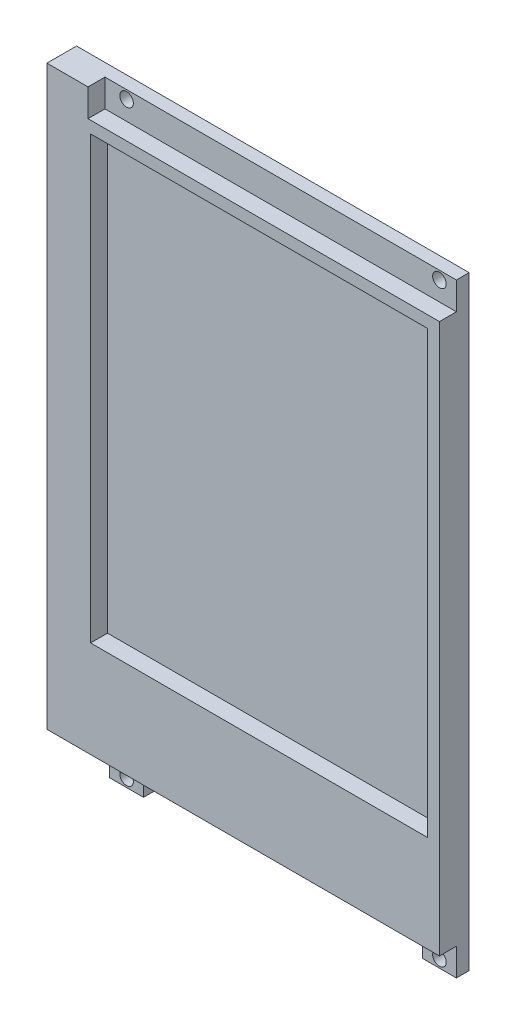
ISO-10303-21;
HEADER;
FILE_DESCRIPTION(('STEP AP214'),'2;1');
FILE_NAME('part.step','',(''),(''),'','','');
FILE_SCHEMA(('AUTOMOTIVE_DESIGN { 1 0 10303 214 1 1 1 1 }'));
ENDSEC;
DATA;
#1=APPLICATION_CONTEXT('core data for automotive mechanical design processes');
#2=APPLICATION_PROTOCOL_DEFINITION('international standard','automotive_design',2000,#1);
#3=PRODUCT_CONTEXT('',#1,'mechanical');
#4=PRODUCT('Part','Part','',(#3));
#5=PRODUCT_RELATED_PRODUCT_CATEGORY('part','',(#4));
#6=PRODUCT_DEFINITION_FORMATION('','',#4);
#7=PRODUCT_DEFINITION_CONTEXT('part definition',#1,'design');
#8=PRODUCT_DEFINITION('design','',#6,#7);
#9=PRODUCT_DEFINITION_SHAPE('','',#8);
#10=(LENGTH_UNIT() NAMED_UNIT(*) SI_UNIT(.MILLI.,.METRE.));
#11=(NAMED_UNIT(*) PLANE_ANGLE_UNIT() SI_UNIT($,.RADIAN.));
#12=(NAMED_UNIT(*) SI_UNIT($,.STERADIAN.) SOLID_ANGLE_UNIT());
#13=UNCERTAINTY_MEASURE_WITH_UNIT(LENGTH_MEASURE(1.E-05),#10,'distance_accuracy_value','');
#14=(GEOMETRIC_REPRESENTATION_CONTEXT(3) GLOBAL_UNCERTAINTY_ASSIGNED_CONTEXT((#13)) GLOBAL_UNIT_ASSIGNED_CONTEXT((#10,
#11,#12)) REPRESENTATION_CONTEXT('',''));
#15=CARTESIAN_POINT('',(0.,0.,0.));
#16=DIRECTION('',(0.,0.,1.));
#17=DIRECTION('',(1.,0.,0.));
#18=AXIS2_PLACEMENT_3D('',#15,#16,#17);
#19=CARTESIAN_POINT('',(-44.9999999999998,-96.6000000000001,7.00000000000038));
#20=DIRECTION('',(0.,1.,0.));
#21=DIRECTION('',(0.,0.,1.));
#22=AXIS2_PLACEMENT_3D('',#19,#20,#21);
#23=PLANE('',#22);
#24=DIRECTION('',(1.,0.,0.));
#25=VECTOR('',#24,1.);
#26=CARTESIAN_POINT('',(-44.9999999999998,-96.6000000000001,4.26741975090295E-13));
#27=LINE('',#26,#25);
#28=CARTESIAN_POINT('',(-34.1999999999983,-96.6000000000001,3.00107161343988E-13));
#29=VERTEX_POINT('',#28);
#30=CARTESIAN_POINT('',(-26.1999999999983,-96.6000000000001,3.86843335142828E-13));
#31=VERTEX_POINT('',#30);
#32=EDGE_CURVE('E294',#29,#31,#27,.T.);
#33=ORIENTED_EDGE('',*,*,#32,.T.);
#34=DIRECTION('',(0.,0.,1.));
#35=VECTOR('',#34,1.);
#36=CARTESIAN_POINT('',(-26.1999999999983,-96.6000000000002,7.00000000000046));
#37=LINE('',#36,#35);
#38=CARTESIAN_POINT('',(-26.1999999999983,-96.6000000000001,3.00000000000036));
#39=VERTEX_POINT('',#38);
#40=EDGE_CURVE('E183',#31,#39,#37,.T.);
#41=ORIENTED_EDGE('',*,*,#40,.T.);
#42=DIRECTION('',(-1.,0.,0.));
#43=VECTOR('',#42,1.);
#44=CARTESIAN_POINT('',(-44.9999999999998,-96.6000000000002,3.00000000000038));
#45=LINE('',#44,#43);
#46=CARTESIAN_POINT('',(-34.1999999999983,-96.6000000000002,3.00000000000034));
#47=VERTEX_POINT('',#46);
#48=EDGE_CURVE('E206',#39,#47,#45,.T.);
#49=ORIENTED_EDGE('',*,*,#48,.T.);
#50=DIRECTION('',(0.,0.,-1.));
#51=VECTOR('',#50,1.);
#52=CARTESIAN_POINT('',(-34.1999999999983,-96.6000000000001,7.00000000000012));
#53=LINE('',#52,#51);
#54=EDGE_CURVE('E193',#47,#29,#53,.T.);
#55=ORIENTED_EDGE('',*,*,#54,.T.);
#56=EDGE_LOOP('',(#33,#41,#49,#55));
#57=FACE_BOUND('',#56,.T.);
#58=ADVANCED_FACE('F32',(#57),#23,.F.);
#59=CARTESIAN_POINT('',(-59.9999999999998,-90.1000000000015,3.00000000000034));
#60=DIRECTION('',(0.,0.,-1.));
#61=DIRECTION('',(-1.,0.,0.));
#62=AXIS2_PLACEMENT_3D('',#59,#60,#61);
#63=PLANE('',#62);
#64=CARTESIAN_POINT('',(-30.1999999999983,-94.6000000000001,3.00000000000031));
#65=DIRECTION('',(0.,0.,-1.));
#66=DIRECTION('',(-1.,0.,0.));
#67=AXIS2_PLACEMENT_3D('',#64,#65,#66);
#68=CIRCLE('',#67,1.6);
#69=CARTESIAN_POINT('',(-31.7999999999983,-94.6000000000001,3.00000000000031));
#70=VERTEX_POINT('',#69);
#71=EDGE_CURVE('E318',#70,#70,#68,.F.);
#72=ORIENTED_EDGE('',*,*,#71,.F.);
#73=EDGE_LOOP('',(#72));
#74=FACE_BOUND('',#73,.T.);
#75=ORIENTED_EDGE('',*,*,#48,.F.);
#76=DIRECTION('',(0.,1.,0.));
#77=VECTOR('',#76,1.);
#78=CARTESIAN_POINT('',(-26.1999999999983,-90.1000000000013,3.00000000000038));
#79=LINE('',#78,#77);
#80=CARTESIAN_POINT('',(-26.1999999999983,-90.1,3.00000000000036));
#81=VERTEX_POINT('',#80);
#82=EDGE_CURVE('E11',#39,#81,#79,.T.);
#83=ORIENTED_EDGE('',*,*,#82,.T.);
#84=DIRECTION('',(-1.,0.,0.));
#85=VECTOR('',#84,1.);
#86=CARTESIAN_POINT('',(-59.9999999999998,-90.1000000000015,3.00000000000034));
#87=LINE('',#86,#85);
#88=CARTESIAN_POINT('',(-34.1999999999983,-90.1000000000014,3.00000000000034));
#89=VERTEX_POINT('',#88);
#90=EDGE_CURVE('E54',#81,#89,#87,.T.);
#91=ORIENTED_EDGE('',*,*,#90,.T.);
#92=DIRECTION('',(0.,-1.,0.));
#93=VECTOR('',#92,1.);
#94=CARTESIAN_POINT('',(-34.1999999999983,-90.1000000000014,3.00000000000036));
#95=LINE('',#94,#93);
#96=EDGE_CURVE('E321',#89,#47,#95,.T.);
#97=ORIENTED_EDGE('',*,*,#96,.T.);
#98=EDGE_LOOP('',(#75,#83,#91,#97));
#99=FACE_BOUND('',#98,.T.);
#100=ADVANCED_FACE('F365',(#74,#99),#63,.F.);
#101=CARTESIAN_POINT('',(47.6000000000001,46.0000000000002,6.99999999999976));
#102=DIRECTION('',(0.,-1.,0.));
#103=DIRECTION('',(1.,0.,0.));
#104=AXIS2_PLACEMENT_3D('',#101,#102,#103);
#105=PLANE('',#104);
#106=DIRECTION('',(-1.,0.,0.));
#107=VECTOR('',#106,1.);
#108=CARTESIAN_POINT('',(47.6000000000001,46.0000000000002,6.99999999999976));
#109=LINE('',#108,#107);
#110=CARTESIAN_POINT('',(-35.2999999999994,46.0000000000001,6.9999999999998));
#111=VERTEX_POINT('',#110);
#112=CARTESIAN_POINT('',(-44.9999999999996,46.,6.99999999999979));
#113=VERTEX_POINT('',#112);
#114=EDGE_CURVE('E300',#111,#113,#109,.T.);
#115=ORIENTED_EDGE('',*,*,#114,.F.);
#116=DIRECTION('',(0.,0.,-1.));
#117=VECTOR('',#116,1.);
#118=CARTESIAN_POINT('',(-35.2999999999994,46.0000000000001,6.9999999999998));
#119=LINE('',#118,#117);
#120=CARTESIAN_POINT('',(-35.2999999999994,46.,2.99999999999998));
#121=VERTEX_POINT('',#120);
#122=EDGE_CURVE('E238',#111,#121,#119,.T.);
#123=ORIENTED_EDGE('',*,*,#122,.T.);
#124=DIRECTION('',(1.,0.,0.));
#125=VECTOR('',#124,1.);
#126=CARTESIAN_POINT('',(47.6000000000001,46.0000000000004,2.99999999999978));
#127=LINE('',#126,#125);
#128=CARTESIAN_POINT('',(47.6000000000001,46.0000000000004,2.99999999999978));
#129=VERTEX_POINT('',#128);
#130=EDGE_CURVE('E235',#121,#129,#127,.T.);
#131=ORIENTED_EDGE('',*,*,#130,.T.);
#132=DIRECTION('',(0.,0.,-1.));
#133=VECTOR('',#132,1.);
#134=CARTESIAN_POINT('',(47.6000000000001,46.0000000000002,6.99999999999976));
#135=LINE('',#134,#133);
#136=CARTESIAN_POINT('',(47.6000000000001,46.0000000000003,-2.84494650060196E-13));
#137=VERTEX_POINT('',#136);
#138=EDGE_CURVE('E307',#129,#137,#135,.T.);
#139=ORIENTED_EDGE('',*,*,#138,.T.);
#140=DIRECTION('',(-1.,0.,0.));
#141=VECTOR('',#140,1.);
#142=CARTESIAN_POINT('',(47.6000000000001,46.0000000000003,-2.84494650060196E-13));
#143=LINE('',#142,#141);
#144=CARTESIAN_POINT('',(-44.9999999999996,46.,0.));
#145=VERTEX_POINT('',#144);
#146=EDGE_CURVE('E288',#137,#145,#143,.T.);
#147=ORIENTED_EDGE('',*,*,#146,.T.);
#148=DIRECTION('',(0.,0.,-1.));
#149=VECTOR('',#148,1.);
#150=CARTESIAN_POINT('',(-44.9999999999996,46.,6.99999999999979));
#151=LINE('',#150,#149);
#152=EDGE_CURVE('E312',#113,#145,#151,.T.);
#153=ORIENTED_EDGE('',*,*,#152,.F.);
#154=EDGE_LOOP('',(#115,#123,#131,#139,#147,#153));
#155=FACE_BOUND('',#154,.T.);
#156=ADVANCED_FACE('F34',(#155),#105,.F.);
#157=CARTESIAN_POINT('',(-44.9999999999996,46.,6.99999999999979));
#158=DIRECTION('',(1.,0.,0.));
#159=DIRECTION('',(0.,1.,0.));
#160=AXIS2_PLACEMENT_3D('',#157,#158,#159);
#161=PLANE('',#160);
#162=DIRECTION('',(0.,-1.,0.));
#163=VECTOR('',#162,1.);
#164=CARTESIAN_POINT('',(-44.9999999999996,46.,0.));
#165=LINE('',#164,#163);
#166=CARTESIAN_POINT('',(-44.9999999999998,-90.1,2.89698820488127E-13));
#167=VERTEX_POINT('',#166);
#168=EDGE_CURVE('E291',#145,#167,#165,.T.);
#169=ORIENTED_EDGE('',*,*,#168,.T.);
#170=DIRECTION('',(0.,0.,1.));
#171=VECTOR('',#170,1.);
#172=CARTESIAN_POINT('',(-44.9999999999997,-90.1000000000013,7.00000000000004));
#173=LINE('',#172,#171);
#174=CARTESIAN_POINT('',(-44.9999999999998,-90.1000000000013,7.00000000000004));
#175=VERTEX_POINT('',#174);
#176=EDGE_CURVE('E213',#167,#175,#173,.T.);
#177=ORIENTED_EDGE('',*,*,#176,.T.);
#178=DIRECTION('',(0.,-1.,0.));
#179=VECTOR('',#178,1.);
#180=CARTESIAN_POINT('',(-44.9999999999996,46.,6.99999999999979));
#181=LINE('',#180,#179);
#182=EDGE_CURVE('E302',#113,#175,#181,.T.);
#183=ORIENTED_EDGE('',*,*,#182,.F.);
#184=ORIENTED_EDGE('',*,*,#152,.T.);
#185=EDGE_LOOP('',(#169,#177,#183,#184));
#186=FACE_BOUND('',#185,.T.);
#187=ADVANCED_FACE('F351',(#186),#161,.F.);
#188=CARTESIAN_POINT('',(47.6000000000004,-96.6000000000003,3.00000000000013));
#189=VERTEX_POINT('',#188);
#190=CARTESIAN_POINT('',(39.6000000000018,-96.6000000000002,3.00000000000016));
#191=VERTEX_POINT('',#190);
#192=EDGE_CURVE('E207',#189,#191,#45,.T.);
#193=ORIENTED_EDGE('',*,*,#192,.T.);
#194=DIRECTION('',(0.,0.,-1.));
#195=VECTOR('',#194,1.);
#196=CARTESIAN_POINT('',(39.6000000000018,-96.6000000000001,7.00000000000006));
#197=LINE('',#196,#195);
#198=CARTESIAN_POINT('',(39.6000000000018,-96.6000000000002,1.96023752785379E-13));
#199=VERTEX_POINT('',#198);
#200=EDGE_CURVE('E47',#191,#199,#197,.T.);
#201=ORIENTED_EDGE('',*,*,#200,.T.);
#202=CARTESIAN_POINT('',(47.6000000000004,-96.6000000000001,1.6826817716975E-13));
#203=VERTEX_POINT('',#202);
#204=EDGE_CURVE('E177',#199,#203,#27,.T.);
#205=ORIENTED_EDGE('',*,*,#204,.T.);
#206=DIRECTION('',(0.,0.,-1.));
#207=VECTOR('',#206,1.);
#208=CARTESIAN_POINT('',(47.6000000000004,-96.6000000000002,7.00000000000008));
#209=LINE('',#208,#207);
#210=EDGE_CURVE('E309',#189,#203,#209,.T.);
#211=ORIENTED_EDGE('',*,*,#210,.F.);
#212=EDGE_LOOP('',(#193,#201,#205,#211));
#213=FACE_BOUND('',#212,.T.);
#214=ADVANCED_FACE('F326',(#213),#23,.F.);
#215=CARTESIAN_POINT('',(47.6000000000004,-96.6000000000002,7.00000000000008));
#216=DIRECTION('',(-1.,0.,0.));
#217=DIRECTION('',(0.,-1.,0.));
#218=AXIS2_PLACEMENT_3D('',#215,#216,#217);
#219=PLANE('',#218);
#220=DIRECTION('',(0.,1.,0.));
#221=VECTOR('',#220,1.);
#222=CARTESIAN_POINT('',(47.6000000000004,-96.6000000000002,7.00000000000008));
#223=LINE('',#222,#221);
#224=CARTESIAN_POINT('',(47.6000000000004,-90.1000000000015,7.00000000000015));
#225=VERTEX_POINT('',#224);
#226=CARTESIAN_POINT('',(47.6000000000001,39.4999999999988,6.99999999999997));
#227=VERTEX_POINT('',#226);
#228=EDGE_CURVE('E305',#225,#227,#223,.T.);
#229=ORIENTED_EDGE('',*,*,#228,.F.);
#230=DIRECTION('',(0.,0.,-1.));
#231=VECTOR('',#230,1.);
#232=CARTESIAN_POINT('',(47.6000000000004,-90.1000000000015,7.00000000000015));
#233=LINE('',#232,#231);
#234=CARTESIAN_POINT('',(47.6000000000004,-90.1000000000016,3.00000000000019));
#235=VERTEX_POINT('',#234);
#236=EDGE_CURVE('E210',#225,#235,#233,.T.);
#237=ORIENTED_EDGE('',*,*,#236,.T.);
#238=DIRECTION('',(0.,-1.,0.));
#239=VECTOR('',#238,1.);
#240=CARTESIAN_POINT('',(47.6000000000004,-96.6000000000003,3.00000000000013));
#241=LINE('',#240,#239);
#242=EDGE_CURVE('E203',#235,#189,#241,.T.);
#243=ORIENTED_EDGE('',*,*,#242,.T.);
#244=ORIENTED_EDGE('',*,*,#210,.T.);
#245=DIRECTION('',(0.,1.,0.));
#246=VECTOR('',#245,1.);
#247=CARTESIAN_POINT('',(47.6000000000004,-96.6000000000001,1.6826817716975E-13));
#248=LINE('',#247,#246);
#249=EDGE_CURVE('E297',#203,#137,#248,.T.);
#250=ORIENTED_EDGE('',*,*,#249,.T.);
#251=ORIENTED_EDGE('',*,*,#138,.F.);
#252=DIRECTION('',(0.,-1.,0.));
#253=VECTOR('',#252,1.);
#254=CARTESIAN_POINT('',(47.6000000000004,-96.6000000000003,3.00000000000013));
#255=LINE('',#254,#253);
#256=CARTESIAN_POINT('',(47.6000000000001,39.499999999999,2.99999999999962));
#257=VERTEX_POINT('',#256);
#258=EDGE_CURVE('E232',#129,#257,#255,.T.);
#259=ORIENTED_EDGE('',*,*,#258,.T.);
#260=DIRECTION('',(0.,0.,1.));
#261=VECTOR('',#260,1.);
#262=CARTESIAN_POINT('',(47.6000000000001,39.4999999999988,6.99999999999997));
#263=LINE('',#262,#261);
#264=EDGE_CURVE('E241',#257,#227,#263,.T.);
#265=ORIENTED_EDGE('',*,*,#264,.T.);
#266=EDGE_LOOP('',(#229,#237,#243,#244,#250,#251,#259,#265));
#267=FACE_BOUND('',#266,.T.);
#268=ADVANCED_FACE('F329',(#267),#219,.F.);
#269=CARTESIAN_POINT('',(-44.9999999999996,46.,6.99999999999979));
#270=DIRECTION('',(0.,0.,1.));
#271=DIRECTION('',(1.,0.,0.));
#272=AXIS2_PLACEMENT_3D('',#269,#270,#271);
#273=PLANE('',#272);
#274=DIRECTION('',(-1.,0.,0.));
#275=VECTOR('',#274,1.);
#276=CARTESIAN_POINT('',(-59.9999999999998,-90.1000000000014,7.00000000000036));
#277=LINE('',#276,#275);
#278=EDGE_CURVE('E196',#225,#175,#277,.T.);
#279=ORIENTED_EDGE('',*,*,#278,.F.);
#280=ORIENTED_EDGE('',*,*,#228,.T.);
#281=DIRECTION('',(1.,0.,0.));
#282=VECTOR('',#281,1.);
#283=CARTESIAN_POINT('',(-35.2999999999999,39.4999999999986,7.00000000000001));
#284=LINE('',#283,#282);
#285=CARTESIAN_POINT('',(-35.2999999999999,39.4999999999986,7.00000000000001));
#286=VERTEX_POINT('',#285);
#287=EDGE_CURVE('E216',#286,#227,#284,.T.);
#288=ORIENTED_EDGE('',*,*,#287,.F.);
#289=DIRECTION('',(0.,-1.,0.));
#290=VECTOR('',#289,1.);
#291=CARTESIAN_POINT('',(-35.2999999999998,49.,7.00000000000002));
#292=LINE('',#291,#290);
#293=EDGE_CURVE('E219',#111,#286,#292,.T.);
#294=ORIENTED_EDGE('',*,*,#293,.F.);
#295=ORIENTED_EDGE('',*,*,#114,.T.);
#296=ORIENTED_EDGE('',*,*,#182,.T.);
#297=EDGE_LOOP('',(#279,#280,#288,#294,#295,#296));
#298=FACE_BOUND('',#297,.T.);
#299=DIRECTION('',(0.,-1.,0.));
#300=VECTOR('',#299,1.);
#301=CARTESIAN_POINT('',(-34.7000000000001,36.7000000000001,6.99999999999999));
#302=LINE('',#301,#300);
#303=CARTESIAN_POINT('',(-34.7000000000001,36.7000000000001,6.99999999999999));
#304=VERTEX_POINT('',#303);
#305=CARTESIAN_POINT('',(-34.6999999999998,-67.2999999999999,7.00000000000006));
#306=VERTEX_POINT('',#305);
#307=EDGE_CURVE('E244',#304,#306,#302,.T.);
#308=ORIENTED_EDGE('',*,*,#307,.F.);
#309=DIRECTION('',(-1.,0.,0.));
#310=VECTOR('',#309,1.);
#311=CARTESIAN_POINT('',(-34.7000000000001,36.7000000000001,6.99999999999999));
#312=LINE('',#311,#310);
#313=CARTESIAN_POINT('',(44.8,36.7000000000003,6.99999999999962));
#314=VERTEX_POINT('',#313);
#315=EDGE_CURVE('E252',#314,#304,#312,.T.);
#316=ORIENTED_EDGE('',*,*,#315,.F.);
#317=DIRECTION('',(0.,1.,0.));
#318=VECTOR('',#317,1.);
#319=CARTESIAN_POINT('',(44.8,36.7000000000003,6.99999999999962));
#320=LINE('',#319,#318);
#321=CARTESIAN_POINT('',(44.8000000000004,-67.2999999999999,7.00000000000006));
#322=VERTEX_POINT('',#321);
#323=EDGE_CURVE('E249',#322,#314,#320,.T.);
#324=ORIENTED_EDGE('',*,*,#323,.F.);
#325=DIRECTION('',(1.,0.,0.));
#326=VECTOR('',#325,1.);
#327=CARTESIAN_POINT('',(-34.6999999999998,-67.2999999999999,7.00000000000006));
#328=LINE('',#327,#326);
#329=EDGE_CURVE('E246',#306,#322,#328,.T.);
#330=ORIENTED_EDGE('',*,*,#329,.F.);
#331=EDGE_LOOP('',(#308,#316,#324,#330));
#332=FACE_BOUND('',#331,.T.);
#333=ADVANCED_FACE('F347',(#298,#332),#273,.T.);
#334=CARTESIAN_POINT('',(-44.9999999999996,46.,0.));
#335=DIRECTION('',(0.,0.,1.));
#336=DIRECTION('',(1.,0.,0.));
#337=AXIS2_PLACEMENT_3D('',#334,#335,#336);
#338=PLANE('',#337);
#339=CARTESIAN_POINT('',(-30.1999999999996,44.0000000000002,0.));
#340=DIRECTION('',(0.,0.,1.));
#341=DIRECTION('',(1.,0.,0.));
#342=AXIS2_PLACEMENT_3D('',#339,#340,#341);
#343=CIRCLE('',#342,1.6);
#344=CARTESIAN_POINT('',(-28.5999999999996,44.0000000000002,0.));
#345=VERTEX_POINT('',#344);
#346=EDGE_CURVE('E270',#345,#345,#343,.T.);
#347=ORIENTED_EDGE('',*,*,#346,.T.);
#348=EDGE_LOOP('',(#347));
#349=FACE_BOUND('',#348,.T.);
#350=CARTESIAN_POINT('',(-30.1999999999983,-94.6000000000001,2.89698820488127E-13));
#351=DIRECTION('',(0.,0.,1.));
#352=DIRECTION('',(1.,0.,0.));
#353=AXIS2_PLACEMENT_3D('',#350,#351,#352);
#354=CIRCLE('',#353,1.6);
#355=CARTESIAN_POINT('',(-28.5999999999983,-94.6000000000001,2.90337212319702E-13));
#356=VERTEX_POINT('',#355);
#357=EDGE_CURVE('E279',#356,#356,#354,.T.);
#358=ORIENTED_EDGE('',*,*,#357,.T.);
#359=EDGE_LOOP('',(#358));
#360=FACE_BOUND('',#359,.T.);
#361=CARTESIAN_POINT('',(43.6000000000018,-94.6000000000002,1.57859836313889E-13));
#362=DIRECTION('',(0.,0.,1.));
#363=DIRECTION('',(1.,0.,0.));
#364=AXIS2_PLACEMENT_3D('',#361,#362,#363);
#365=CIRCLE('',#364,1.60000000000001);
#366=CARTESIAN_POINT('',(45.2000000000018,-94.6000000000002,1.58498228145464E-13));
#367=VERTEX_POINT('',#366);
#368=EDGE_CURVE('E282',#367,#367,#365,.T.);
#369=ORIENTED_EDGE('',*,*,#368,.T.);
#370=EDGE_LOOP('',(#369));
#371=FACE_BOUND('',#370,.T.);
#372=CARTESIAN_POINT('',(43.6000000000005,44.0000000000002,0.));
#373=DIRECTION('',(0.,0.,1.));
#374=DIRECTION('',(1.,0.,0.));
#375=AXIS2_PLACEMENT_3D('',#372,#373,#374);
#376=CIRCLE('',#375,1.6);
#377=CARTESIAN_POINT('',(45.2000000000005,44.0000000000002,0.));
#378=VERTEX_POINT('',#377);
#379=EDGE_CURVE('E285',#378,#378,#376,.T.);
#380=ORIENTED_EDGE('',*,*,#379,.T.);
#381=EDGE_LOOP('',(#380));
#382=FACE_BOUND('',#381,.T.);
#383=DIRECTION('',(1.,0.,0.));
#384=VECTOR('',#383,1.);
#385=CARTESIAN_POINT('',(39.6000000000018,-90.1000000000001,1.43982048506075E-13));
#386=LINE('',#385,#384);
#387=CARTESIAN_POINT('',(-26.1999999999983,-90.1,3.05311331771918E-13));
#388=VERTEX_POINT('',#387);
#389=CARTESIAN_POINT('',(39.6000000000018,-90.1000000000001,1.43982048506075E-13));
#390=VERTEX_POINT('',#389);
#391=EDGE_CURVE('E168',#388,#390,#386,.T.);
#392=ORIENTED_EDGE('',*,*,#391,.F.);
#393=DIRECTION('',(0.,1.,0.));
#394=VECTOR('',#393,1.);
#395=CARTESIAN_POINT('',(-26.1999999999983,-90.1,3.05311331771918E-13));
#396=LINE('',#395,#394);
#397=EDGE_CURVE('E165',#31,#388,#396,.T.);
#398=ORIENTED_EDGE('',*,*,#397,.F.);
#399=ORIENTED_EDGE('',*,*,#32,.F.);
#400=DIRECTION('',(0.,-1.,0.));
#401=VECTOR('',#400,1.);
#402=CARTESIAN_POINT('',(-34.1999999999983,-90.1000000000001,3.3133218391157E-13));
#403=LINE('',#402,#401);
#404=CARTESIAN_POINT('',(-34.1999999999983,-90.1000000000001,3.3133218391157E-13));
#405=VERTEX_POINT('',#404);
#406=EDGE_CURVE('E189',#405,#29,#403,.T.);
#407=ORIENTED_EDGE('',*,*,#406,.F.);
#408=DIRECTION('',(1.,0.,0.));
#409=VECTOR('',#408,1.);
#410=CARTESIAN_POINT('',(-34.1999999999983,-90.1000000000001,3.3133218391157E-13));
#411=LINE('',#410,#409);
#412=EDGE_CURVE('E186',#167,#405,#411,.T.);
#413=ORIENTED_EDGE('',*,*,#412,.F.);
#414=ORIENTED_EDGE('',*,*,#168,.F.);
#415=ORIENTED_EDGE('',*,*,#146,.F.);
#416=ORIENTED_EDGE('',*,*,#249,.F.);
#417=ORIENTED_EDGE('',*,*,#204,.F.);
#418=DIRECTION('',(0.,-1.,0.));
#419=VECTOR('',#418,1.);
#420=CARTESIAN_POINT('',(39.6000000000018,-90.1000000000001,1.43982048506075E-13));
#421=LINE('',#420,#419);
#422=EDGE_CURVE('E160',#390,#199,#421,.T.);
#423=ORIENTED_EDGE('',*,*,#422,.F.);
#424=EDGE_LOOP('',(#392,#398,#399,#407,#413,#414,#415,#416,#417,#423));
#425=FACE_BOUND('',#424,.T.);
#426=ADVANCED_FACE('F175',(#349,#360,#371,#382,#425),#338,.F.);
#427=CARTESIAN_POINT('',(43.6000000000005,44.0000000000002,0.));
#428=DIRECTION('',(0.,0.,1.));
#429=DIRECTION('',(1.,0.,0.));
#430=AXIS2_PLACEMENT_3D('',#427,#428,#429);
#431=CYLINDRICAL_SURFACE('',#430,1.6);
#432=CARTESIAN_POINT('',(43.6000000000006,44.0000000000003,2.99999999999995));
#433=DIRECTION('',(0.,0.,-1.));
#434=DIRECTION('',(-1.,0.,0.));
#435=AXIS2_PLACEMENT_3D('',#432,#433,#434);
#436=CIRCLE('',#435,1.6);
#437=CARTESIAN_POINT('',(42.0000000000006,44.0000000000003,2.99999999999995));
#438=VERTEX_POINT('',#437);
#439=EDGE_CURVE('E229',#438,#438,#436,.F.);
#440=ORIENTED_EDGE('',*,*,#439,.T.);
#441=EDGE_LOOP('',(#440));
#442=FACE_BOUND('',#441,.T.);
#443=ORIENTED_EDGE('',*,*,#379,.F.);
#444=EDGE_LOOP('',(#443));
#445=FACE_BOUND('',#444,.T.);
#446=ADVANCED_FACE('F535',(#442,#445),#431,.F.);
#447=CARTESIAN_POINT('',(43.6000000000018,-94.6000000000002,1.57859836313889E-13));
#448=DIRECTION('',(0.,0.,1.));
#449=DIRECTION('',(1.,0.,0.));
#450=AXIS2_PLACEMENT_3D('',#447,#448,#449);
#451=CYLINDRICAL_SURFACE('',#450,1.60000000000001);
#452=CARTESIAN_POINT('',(43.6000000000018,-94.6000000000002,3.00000000000019));
#453=DIRECTION('',(0.,0.,-1.));
#454=DIRECTION('',(-1.,0.,0.));
#455=AXIS2_PLACEMENT_3D('',#452,#453,#454);
#456=CIRCLE('',#455,1.60000000000001);
#457=CARTESIAN_POINT('',(42.0000000000018,-94.6000000000002,3.00000000000019));
#458=VERTEX_POINT('',#457);
#459=EDGE_CURVE('E200',#458,#458,#456,.F.);
#460=ORIENTED_EDGE('',*,*,#459,.T.);
#461=EDGE_LOOP('',(#460));
#462=FACE_BOUND('',#461,.T.);
#463=ORIENTED_EDGE('',*,*,#368,.F.);
#464=EDGE_LOOP('',(#463));
#465=FACE_BOUND('',#464,.T.);
#466=ADVANCED_FACE('F525',(#462,#465),#451,.F.);
#467=CARTESIAN_POINT('',(-30.1999999999983,-94.6000000000001,2.89698820488127E-13));
#468=DIRECTION('',(0.,0.,1.));
#469=DIRECTION('',(1.,0.,0.));
#470=AXIS2_PLACEMENT_3D('',#467,#468,#469);
#471=CYLINDRICAL_SURFACE('',#470,1.6);
#472=ORIENTED_EDGE('',*,*,#71,.T.);
#473=EDGE_LOOP('',(#472));
#474=FACE_BOUND('',#473,.T.);
#475=ORIENTED_EDGE('',*,*,#357,.F.);
#476=EDGE_LOOP('',(#475));
#477=FACE_BOUND('',#476,.T.);
#478=ADVANCED_FACE('F515',(#474,#477),#471,.F.);
#479=CARTESIAN_POINT('',(-30.1999999999996,44.0000000000002,0.));
#480=DIRECTION('',(0.,0.,1.));
#481=DIRECTION('',(1.,0.,0.));
#482=AXIS2_PLACEMENT_3D('',#479,#480,#481);
#483=CYLINDRICAL_SURFACE('',#482,1.6);
#484=CARTESIAN_POINT('',(-30.1999999999996,44.0000000000004,3.00000000000011));
#485=DIRECTION('',(0.,0.,-1.));
#486=DIRECTION('',(-1.,0.,0.));
#487=AXIS2_PLACEMENT_3D('',#484,#485,#486);
#488=CIRCLE('',#487,1.6);
#489=CARTESIAN_POINT('',(-31.7999999999996,44.0000000000004,3.00000000000011));
#490=VERTEX_POINT('',#489);
#491=EDGE_CURVE('E315',#490,#490,#488,.F.);
#492=ORIENTED_EDGE('',*,*,#491,.T.);
#493=EDGE_LOOP('',(#492));
#494=FACE_BOUND('',#493,.T.);
#495=ORIENTED_EDGE('',*,*,#346,.F.);
#496=EDGE_LOOP('',(#495));
#497=FACE_BOUND('',#496,.T.);
#498=ADVANCED_FACE('F505',(#494,#497),#483,.F.);
#499=CARTESIAN_POINT('',(-34.7000000000001,36.7000000000001,2.99999999999994));
#500=DIRECTION('',(-1.,0.,0.));
#501=DIRECTION('',(0.,0.,1.));
#502=AXIS2_PLACEMENT_3D('',#499,#500,#501);
#503=PLANE('',#502);
#504=ORIENTED_EDGE('',*,*,#307,.T.);
#505=DIRECTION('',(0.,0.,1.));
#506=VECTOR('',#505,1.);
#507=CARTESIAN_POINT('',(-34.6999999999998,-67.3000000000001,3.00000000000019));
#508=LINE('',#507,#506);
#509=CARTESIAN_POINT('',(-34.6999999999998,-67.3000000000001,3.00000000000019));
#510=VERTEX_POINT('',#509);
#511=EDGE_CURVE('E267',#510,#306,#508,.T.);
#512=ORIENTED_EDGE('',*,*,#511,.F.);
#513=DIRECTION('',(0.,-1.,0.));
#514=VECTOR('',#513,1.);
#515=CARTESIAN_POINT('',(-34.7000000000001,36.7000000000001,2.99999999999994));
#516=LINE('',#515,#514);
#517=CARTESIAN_POINT('',(-34.7000000000001,36.7000000000001,2.99999999999994));
#518=VERTEX_POINT('',#517);
#519=EDGE_CURVE('E255',#518,#510,#516,.T.);
#520=ORIENTED_EDGE('',*,*,#519,.F.);
#521=DIRECTION('',(0.,0.,1.));
#522=VECTOR('',#521,1.);
#523=CARTESIAN_POINT('',(-34.7000000000001,36.7000000000001,2.99999999999994));
#524=LINE('',#523,#522);
#525=EDGE_CURVE('E268',#518,#304,#524,.T.);
#526=ORIENTED_EDGE('',*,*,#525,.T.);
#527=EDGE_LOOP('',(#504,#512,#520,#526));
#528=FACE_BOUND('',#527,.T.);
#529=ADVANCED_FACE('F496',(#528),#503,.F.);
#530=CARTESIAN_POINT('',(-34.7000000000001,36.7000000000001,2.99999999999994));
#531=DIRECTION('',(0.,1.,0.));
#532=DIRECTION('',(-1.,0.,0.));
#533=AXIS2_PLACEMENT_3D('',#530,#531,#532);
#534=PLANE('',#533);
#535=ORIENTED_EDGE('',*,*,#315,.T.);
#536=ORIENTED_EDGE('',*,*,#525,.F.);
#537=DIRECTION('',(-1.,0.,0.));
#538=VECTOR('',#537,1.);
#539=CARTESIAN_POINT('',(-34.7000000000001,36.7000000000001,2.99999999999994));
#540=LINE('',#539,#538);
#541=CARTESIAN_POINT('',(44.8000000000001,36.7000000000001,2.99999999999998));
#542=VERTEX_POINT('',#541);
#543=EDGE_CURVE('E264',#542,#518,#540,.T.);
#544=ORIENTED_EDGE('',*,*,#543,.F.);
#545=DIRECTION('',(0.,0.,1.));
#546=VECTOR('',#545,1.);
#547=CARTESIAN_POINT('',(44.8000000000001,36.7000000000001,2.99999999999998));
#548=LINE('',#547,#546);
#549=EDGE_CURVE('E271',#542,#314,#548,.T.);
#550=ORIENTED_EDGE('',*,*,#549,.T.);
#551=EDGE_LOOP('',(#535,#536,#544,#550));
#552=FACE_BOUND('',#551,.T.);
#553=ADVANCED_FACE('F487',(#552),#534,.F.);
#554=CARTESIAN_POINT('',(44.8000000000001,36.7000000000001,2.99999999999998));
#555=DIRECTION('',(1.,0.,0.));
#556=DIRECTION('',(0.,1.,0.));
#557=AXIS2_PLACEMENT_3D('',#554,#555,#556);
#558=PLANE('',#557);
#559=ORIENTED_EDGE('',*,*,#323,.T.);
#560=ORIENTED_EDGE('',*,*,#549,.F.);
#561=DIRECTION('',(0.,1.,0.));
#562=VECTOR('',#561,1.);
#563=CARTESIAN_POINT('',(44.8000000000001,36.7000000000001,2.99999999999998));
#564=LINE('',#563,#562);
#565=CARTESIAN_POINT('',(44.8000000000004,-67.2999999999999,2.99999999999998));
#566=VERTEX_POINT('',#565);
#567=EDGE_CURVE('E261',#566,#542,#564,.T.);
#568=ORIENTED_EDGE('',*,*,#567,.F.);
#569=DIRECTION('',(0.,0.,1.));
#570=VECTOR('',#569,1.);
#571=CARTESIAN_POINT('',(44.8000000000004,-67.2999999999999,2.99999999999998));
#572=LINE('',#571,#570);
#573=EDGE_CURVE('E273',#566,#322,#572,.T.);
#574=ORIENTED_EDGE('',*,*,#573,.T.);
#575=EDGE_LOOP('',(#559,#560,#568,#574));
#576=FACE_BOUND('',#575,.T.);
#577=ADVANCED_FACE('F476',(#576),#558,.F.);
#578=CARTESIAN_POINT('',(-34.6999999999998,-67.3000000000001,3.00000000000019));
#579=DIRECTION('',(0.,-1.,0.));
#580=DIRECTION('',(0.,0.,-1.));
#581=AXIS2_PLACEMENT_3D('',#578,#579,#580);
#582=PLANE('',#581);
#583=ORIENTED_EDGE('',*,*,#329,.T.);
#584=ORIENTED_EDGE('',*,*,#573,.F.);
#585=DIRECTION('',(1.,0.,0.));
#586=VECTOR('',#585,1.);
#587=CARTESIAN_POINT('',(-34.6999999999998,-67.3000000000001,3.00000000000019));
#588=LINE('',#587,#586);
#589=EDGE_CURVE('E258',#510,#566,#588,.T.);
#590=ORIENTED_EDGE('',*,*,#589,.F.);
#591=ORIENTED_EDGE('',*,*,#511,.T.);
#592=EDGE_LOOP('',(#583,#584,#590,#591));
#593=FACE_BOUND('',#592,.T.);
#594=ADVANCED_FACE('F465',(#593),#582,.F.);
#595=CARTESIAN_POINT('',(-34.6999999999998,-67.3000000000001,3.00000000000019));
#596=DIRECTION('',(0.,0.,1.));
#597=DIRECTION('',(1.,0.,0.));
#598=AXIS2_PLACEMENT_3D('',#595,#596,#597);
#599=PLANE('',#598);
#600=ORIENTED_EDGE('',*,*,#519,.T.);
#601=ORIENTED_EDGE('',*,*,#589,.T.);
#602=ORIENTED_EDGE('',*,*,#567,.T.);
#603=ORIENTED_EDGE('',*,*,#543,.T.);
#604=EDGE_LOOP('',(#600,#601,#602,#603));
#605=FACE_BOUND('',#604,.T.);
#606=ADVANCED_FACE('F362',(#605),#599,.T.);
#607=CARTESIAN_POINT('',(-35.2999999999998,39.4999999999987,3.00000000000001));
#608=DIRECTION('',(0.,-1.,0.));
#609=DIRECTION('',(0.,0.,-1.));
#610=AXIS2_PLACEMENT_3D('',#607,#608,#609);
#611=PLANE('',#610);
#612=DIRECTION('',(1.,0.,0.));
#613=VECTOR('',#612,1.);
#614=CARTESIAN_POINT('',(-35.2999999999998,39.4999999999987,3.00000000000001));
#615=LINE('',#614,#613);
#616=CARTESIAN_POINT('',(-35.2999999999998,39.4999999999987,3.00000000000001));
#617=VERTEX_POINT('',#616);
#618=EDGE_CURVE('E221',#617,#257,#615,.T.);
#619=ORIENTED_EDGE('',*,*,#618,.F.);
#620=DIRECTION('',(0.,0.,1.));
#621=VECTOR('',#620,1.);
#622=CARTESIAN_POINT('',(-35.2999999999998,39.4999999999987,3.00000000000001));
#623=LINE('',#622,#621);
#624=EDGE_CURVE('E226',#617,#286,#623,.T.);
#625=ORIENTED_EDGE('',*,*,#624,.T.);
#626=ORIENTED_EDGE('',*,*,#287,.T.);
#627=ORIENTED_EDGE('',*,*,#264,.F.);
#628=EDGE_LOOP('',(#619,#625,#626,#627));
#629=FACE_BOUND('',#628,.T.);
#630=ADVANCED_FACE('F342',(#629),#611,.F.);
#631=CARTESIAN_POINT('',(-35.2999999999998,49.,3.00000000000001));
#632=DIRECTION('',(-1.,0.,0.));
#633=DIRECTION('',(0.,0.,1.));
#634=AXIS2_PLACEMENT_3D('',#631,#632,#633);
#635=PLANE('',#634);
#636=ORIENTED_EDGE('',*,*,#293,.T.);
#637=ORIENTED_EDGE('',*,*,#624,.F.);
#638=DIRECTION('',(0.,-1.,0.));
#639=VECTOR('',#638,1.);
#640=CARTESIAN_POINT('',(-35.2999999999998,49.,3.00000000000001));
#641=LINE('',#640,#639);
#642=EDGE_CURVE('E224',#121,#617,#641,.T.);
#643=ORIENTED_EDGE('',*,*,#642,.F.);
#644=ORIENTED_EDGE('',*,*,#122,.F.);
#645=EDGE_LOOP('',(#636,#637,#643,#644));
#646=FACE_BOUND('',#645,.T.);
#647=ADVANCED_FACE('F353',(#646),#635,.F.);
#648=CARTESIAN_POINT('',(51.0000000000002,39.4999999999991,2.99999999999962));
#649=DIRECTION('',(0.,0.,-1.));
#650=DIRECTION('',(-1.,0.,0.));
#651=AXIS2_PLACEMENT_3D('',#648,#649,#650);
#652=PLANE('',#651);
#653=ORIENTED_EDGE('',*,*,#439,.F.);
#654=EDGE_LOOP('',(#653));
#655=FACE_BOUND('',#654,.T.);
#656=ORIENTED_EDGE('',*,*,#491,.F.);
#657=EDGE_LOOP('',(#656));
#658=FACE_BOUND('',#657,.T.);
#659=ORIENTED_EDGE('',*,*,#642,.T.);
#660=ORIENTED_EDGE('',*,*,#618,.T.);
#661=ORIENTED_EDGE('',*,*,#258,.F.);
#662=ORIENTED_EDGE('',*,*,#130,.F.);
#663=EDGE_LOOP('',(#659,#660,#661,#662));
#664=FACE_BOUND('',#663,.T.);
#665=ADVANCED_FACE('F337',(#655,#658,#664),#652,.F.);
#666=CARTESIAN_POINT('',(-59.9999999999998,-90.1000000000015,3.00000000000034));
#667=DIRECTION('',(0.,1.,0.));
#668=DIRECTION('',(0.,0.,1.));
#669=AXIS2_PLACEMENT_3D('',#666,#667,#668);
#670=PLANE('',#669);
#671=ORIENTED_EDGE('',*,*,#278,.T.);
#672=ORIENTED_EDGE('',*,*,#176,.F.);
#673=ORIENTED_EDGE('',*,*,#412,.T.);
#674=DIRECTION('',(0.,0.,-1.));
#675=VECTOR('',#674,1.);
#676=CARTESIAN_POINT('',(-34.1999999999988,-90.1,15.));
#677=LINE('',#676,#675);
#678=EDGE_CURVE('E191',#89,#405,#677,.T.);
#679=ORIENTED_EDGE('',*,*,#678,.F.);
#680=ORIENTED_EDGE('',*,*,#90,.F.);
#681=DIRECTION('',(0.,0.,-1.));
#682=VECTOR('',#681,1.);
#683=CARTESIAN_POINT('',(-26.1999999999983,-90.1000000000001,15.0000000000003));
#684=LINE('',#683,#682);
#685=EDGE_CURVE('E164',#81,#388,#684,.T.);
#686=ORIENTED_EDGE('',*,*,#685,.T.);
#687=ORIENTED_EDGE('',*,*,#391,.T.);
#688=DIRECTION('',(0.,0.,-1.));
#689=VECTOR('',#688,1.);
#690=CARTESIAN_POINT('',(39.6000000000014,-90.1000000000002,15.0000000000001));
#691=LINE('',#690,#689);
#692=CARTESIAN_POINT('',(39.6000000000018,-90.1000000000002,3.00000000000019));
#693=VERTEX_POINT('',#692);
#694=EDGE_CURVE('E156',#693,#390,#691,.T.);
#695=ORIENTED_EDGE('',*,*,#694,.F.);
#696=EDGE_CURVE('E198',#235,#693,#87,.T.);
#697=ORIENTED_EDGE('',*,*,#696,.F.);
#698=ORIENTED_EDGE('',*,*,#236,.F.);
#699=EDGE_LOOP('',(#671,#672,#673,#679,#680,#686,#687,#695,#697,#698));
#700=FACE_BOUND('',#699,.T.);
#701=ADVANCED_FACE('F169',(#700),#670,.F.);
#702=ORIENTED_EDGE('',*,*,#459,.F.);
#703=EDGE_LOOP('',(#702));
#704=FACE_BOUND('',#703,.T.);
#705=ORIENTED_EDGE('',*,*,#696,.T.);
#706=DIRECTION('',(0.,-1.,0.));
#707=VECTOR('',#706,1.);
#708=CARTESIAN_POINT('',(39.6000000000018,-90.1000000000014,3.00000000000028));
#709=LINE('',#708,#707);
#710=EDGE_CURVE('E40',#693,#191,#709,.T.);
#711=ORIENTED_EDGE('',*,*,#710,.T.);
#712=ORIENTED_EDGE('',*,*,#192,.F.);
#713=ORIENTED_EDGE('',*,*,#242,.F.);
#714=EDGE_LOOP('',(#705,#711,#712,#713));
#715=FACE_BOUND('',#714,.T.);
#716=ADVANCED_FACE('F323',(#704,#715),#63,.F.);
#717=CARTESIAN_POINT('',(-34.1999999999988,-90.1,15.));
#718=DIRECTION('',(1.,0.,0.));
#719=DIRECTION('',(0.,1.,0.));
#720=AXIS2_PLACEMENT_3D('',#717,#718,#719);
#721=PLANE('',#720);
#722=ORIENTED_EDGE('',*,*,#96,.F.);
#723=ORIENTED_EDGE('',*,*,#678,.T.);
#724=ORIENTED_EDGE('',*,*,#406,.T.);
#725=ORIENTED_EDGE('',*,*,#54,.F.);
#726=EDGE_LOOP('',(#722,#723,#724,#725));
#727=FACE_BOUND('',#726,.T.);
#728=ADVANCED_FACE('F414',(#727),#721,.F.);
#729=CARTESIAN_POINT('',(-26.1999999999983,-90.1000000000001,15.0000000000003));
#730=DIRECTION('',(-1.,0.,0.));
#731=DIRECTION('',(0.,-1.,0.));
#732=AXIS2_PLACEMENT_3D('',#729,#730,#731);
#733=PLANE('',#732);
#734=ORIENTED_EDGE('',*,*,#397,.T.);
#735=ORIENTED_EDGE('',*,*,#685,.F.);
#736=ORIENTED_EDGE('',*,*,#82,.F.);
#737=ORIENTED_EDGE('',*,*,#40,.F.);
#738=EDGE_LOOP('',(#734,#735,#736,#737));
#739=FACE_BOUND('',#738,.T.);
#740=ADVANCED_FACE('F420',(#739),#733,.F.);
#741=CARTESIAN_POINT('',(39.6000000000014,-90.1000000000002,15.0000000000001));
#742=DIRECTION('',(1.,0.,0.));
#743=DIRECTION('',(0.,0.,-1.));
#744=AXIS2_PLACEMENT_3D('',#741,#742,#743);
#745=PLANE('',#744);
#746=ORIENTED_EDGE('',*,*,#710,.F.);
#747=ORIENTED_EDGE('',*,*,#694,.T.);
#748=ORIENTED_EDGE('',*,*,#422,.T.);
#749=ORIENTED_EDGE('',*,*,#200,.F.);
#750=EDGE_LOOP('',(#746,#747,#748,#749));
#751=FACE_BOUND('',#750,.T.);
#752=ADVANCED_FACE('F158',(#751),#745,.F.);
#753=CLOSED_SHELL('',(#58,#100,#156,#187,#214,#268,#333,#426,#446,#466,#478,#498,#529,#553,#577,
#594,#606,#630,#647,#665,#701,#716,#728,#740,#752));
#754=MANIFOLD_SOLID_BREP('B2',#753);
#755=ADVANCED_BREP_SHAPE_REPRESENTATION('',(#18,#754),#14);
#756=SHAPE_DEFINITION_REPRESENTATION(#9,#755);
ENDSEC;
END-ISO-10303-21;
